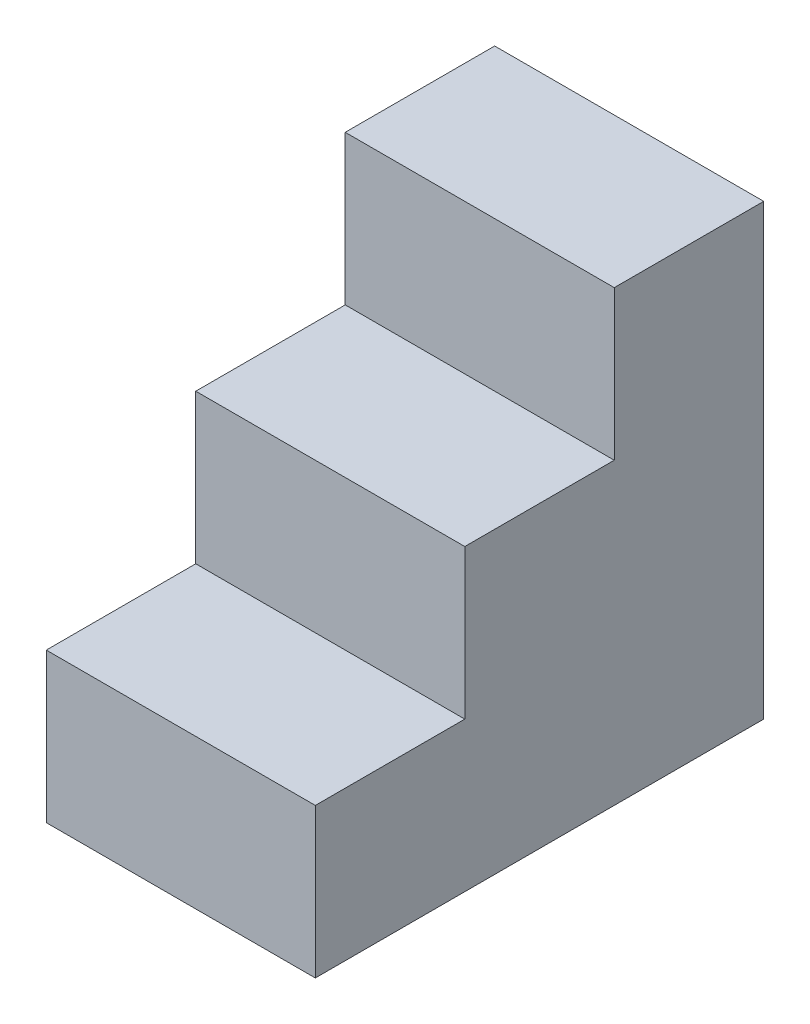
ISO-10303-21;
HEADER;
FILE_DESCRIPTION(('STEP AP214'),'2;1');
FILE_NAME('part.step','',(''),(''),'','','');
FILE_SCHEMA(('AUTOMOTIVE_DESIGN { 1 0 10303 214 1 1 1 1 }'));
ENDSEC;
DATA;
#1=APPLICATION_CONTEXT('core data for automotive mechanical design processes');
#2=APPLICATION_PROTOCOL_DEFINITION('international standard','automotive_design',2000,#1);
#3=PRODUCT_CONTEXT('',#1,'mechanical');
#4=PRODUCT('Part','Part','',(#3));
#5=PRODUCT_RELATED_PRODUCT_CATEGORY('part','',(#4));
#6=PRODUCT_DEFINITION_FORMATION('','',#4);
#7=PRODUCT_DEFINITION_CONTEXT('part definition',#1,'design');
#8=PRODUCT_DEFINITION('design','',#6,#7);
#9=PRODUCT_DEFINITION_SHAPE('','',#8);
#10=(LENGTH_UNIT() NAMED_UNIT(*) SI_UNIT(.MILLI.,.METRE.));
#11=(NAMED_UNIT(*) PLANE_ANGLE_UNIT() SI_UNIT($,.RADIAN.));
#12=(NAMED_UNIT(*) SI_UNIT($,.STERADIAN.) SOLID_ANGLE_UNIT());
#13=UNCERTAINTY_MEASURE_WITH_UNIT(LENGTH_MEASURE(1.E-05),#10,'distance_accuracy_value','');
#14=(GEOMETRIC_REPRESENTATION_CONTEXT(3) GLOBAL_UNCERTAINTY_ASSIGNED_CONTEXT((#13)) GLOBAL_UNIT_ASSIGNED_CONTEXT((#10,
#11,#12)) REPRESENTATION_CONTEXT('',''));
#15=CARTESIAN_POINT('',(0.,0.,0.));
#16=DIRECTION('',(0.,0.,1.));
#17=DIRECTION('',(1.,0.,0.));
#18=AXIS2_PLACEMENT_3D('',#15,#16,#17);
#19=CARTESIAN_POINT('',(19.8,-33.,0.));
#20=DIRECTION('',(0.,0.,1.));
#21=DIRECTION('',(1.,0.,0.));
#22=AXIS2_PLACEMENT_3D('',#19,#20,#21);
#23=PLANE('',#22);
#24=DIRECTION('',(0.,1.,0.));
#25=VECTOR('',#24,1.);
#26=CARTESIAN_POINT('',(0.,-33.,0.));
#27=LINE('',#26,#25);
#28=CARTESIAN_POINT('',(0.,-33.,0.));
#29=VERTEX_POINT('',#28);
#30=CARTESIAN_POINT('',(0.,0.,0.));
#31=VERTEX_POINT('',#30);
#32=EDGE_CURVE('E135',#29,#31,#27,.T.);
#33=ORIENTED_EDGE('',*,*,#32,.T.);
#34=DIRECTION('',(-1.,0.,0.));
#35=VECTOR('',#34,1.);
#36=CARTESIAN_POINT('',(19.8,0.,0.));
#37=LINE('',#36,#35);
#38=CARTESIAN_POINT('',(19.8,0.,0.));
#39=VERTEX_POINT('',#38);
#40=EDGE_CURVE('E11',#39,#31,#37,.T.);
#41=ORIENTED_EDGE('',*,*,#40,.F.);
#42=DIRECTION('',(0.,1.,0.));
#43=VECTOR('',#42,1.);
#44=CARTESIAN_POINT('',(19.8,-33.,0.));
#45=LINE('',#44,#43);
#46=CARTESIAN_POINT('',(19.8,-33.,0.));
#47=VERTEX_POINT('',#46);
#48=EDGE_CURVE('E149',#47,#39,#45,.T.);
#49=ORIENTED_EDGE('',*,*,#48,.F.);
#50=DIRECTION('',(-1.,0.,0.));
#51=VECTOR('',#50,1.);
#52=CARTESIAN_POINT('',(19.8,-33.,0.));
#53=LINE('',#52,#51);
#54=EDGE_CURVE('E131',#47,#29,#53,.T.);
#55=ORIENTED_EDGE('',*,*,#54,.T.);
#56=EDGE_LOOP('',(#33,#41,#49,#55));
#57=FACE_BOUND('',#56,.T.);
#58=ADVANCED_FACE('F39',(#57),#23,.F.);
#59=CARTESIAN_POINT('',(19.8,0.,0.));
#60=DIRECTION('',(0.,-1.,0.));
#61=DIRECTION('',(0.,0.,-1.));
#62=AXIS2_PLACEMENT_3D('',#59,#60,#61);
#63=PLANE('',#62);
#64=DIRECTION('',(0.,0.,1.));
#65=VECTOR('',#64,1.);
#66=CARTESIAN_POINT('',(0.,0.,0.));
#67=LINE('',#66,#65);
#68=CARTESIAN_POINT('',(0.,0.,11.));
#69=VERTEX_POINT('',#68);
#70=EDGE_CURVE('E138',#31,#69,#67,.T.);
#71=ORIENTED_EDGE('',*,*,#70,.T.);
#72=DIRECTION('',(-1.,0.,0.));
#73=VECTOR('',#72,1.);
#74=CARTESIAN_POINT('',(19.8,0.,11.));
#75=LINE('',#74,#73);
#76=CARTESIAN_POINT('',(19.8,0.,11.));
#77=VERTEX_POINT('',#76);
#78=EDGE_CURVE('E47',#77,#69,#75,.T.);
#79=ORIENTED_EDGE('',*,*,#78,.F.);
#80=DIRECTION('',(0.,0.,1.));
#81=VECTOR('',#80,1.);
#82=CARTESIAN_POINT('',(19.8,0.,0.));
#83=LINE('',#82,#81);
#84=EDGE_CURVE('E98',#39,#77,#83,.T.);
#85=ORIENTED_EDGE('',*,*,#84,.F.);
#86=ORIENTED_EDGE('',*,*,#40,.T.);
#87=EDGE_LOOP('',(#71,#79,#85,#86));
#88=FACE_BOUND('',#87,.T.);
#89=ADVANCED_FACE('F184',(#88),#63,.F.);
#90=CARTESIAN_POINT('',(19.8,0.,11.));
#91=DIRECTION('',(0.,0.,-1.));
#92=DIRECTION('',(-1.,0.,0.));
#93=AXIS2_PLACEMENT_3D('',#90,#91,#92);
#94=PLANE('',#93);
#95=DIRECTION('',(0.,-1.,0.));
#96=VECTOR('',#95,1.);
#97=CARTESIAN_POINT('',(0.,0.,11.));
#98=LINE('',#97,#96);
#99=CARTESIAN_POINT('',(0.,-11.,11.));
#100=VERTEX_POINT('',#99);
#101=EDGE_CURVE('E140',#69,#100,#98,.T.);
#102=ORIENTED_EDGE('',*,*,#101,.T.);
#103=DIRECTION('',(-1.,0.,0.));
#104=VECTOR('',#103,1.);
#105=CARTESIAN_POINT('',(19.8,-11.,11.));
#106=LINE('',#105,#104);
#107=CARTESIAN_POINT('',(19.8,-11.,11.));
#108=VERTEX_POINT('',#107);
#109=EDGE_CURVE('E156',#108,#100,#106,.T.);
#110=ORIENTED_EDGE('',*,*,#109,.F.);
#111=DIRECTION('',(0.,-1.,0.));
#112=VECTOR('',#111,1.);
#113=CARTESIAN_POINT('',(19.8,0.,11.));
#114=LINE('',#113,#112);
#115=EDGE_CURVE('E164',#77,#108,#114,.T.);
#116=ORIENTED_EDGE('',*,*,#115,.F.);
#117=ORIENTED_EDGE('',*,*,#78,.T.);
#118=EDGE_LOOP('',(#102,#110,#116,#117));
#119=FACE_BOUND('',#118,.T.);
#120=ADVANCED_FACE('F162',(#119),#94,.F.);
#121=CARTESIAN_POINT('',(19.8,-11.,11.));
#122=DIRECTION('',(0.,-1.,0.));
#123=DIRECTION('',(0.,0.,-1.));
#124=AXIS2_PLACEMENT_3D('',#121,#122,#123);
#125=PLANE('',#124);
#126=DIRECTION('',(0.,0.,1.));
#127=VECTOR('',#126,1.);
#128=CARTESIAN_POINT('',(0.,-11.,11.));
#129=LINE('',#128,#127);
#130=CARTESIAN_POINT('',(0.,-11.,22.));
#131=VERTEX_POINT('',#130);
#132=EDGE_CURVE('E142',#100,#131,#129,.T.);
#133=ORIENTED_EDGE('',*,*,#132,.T.);
#134=DIRECTION('',(-1.,0.,0.));
#135=VECTOR('',#134,1.);
#136=CARTESIAN_POINT('',(19.8,-11.,22.));
#137=LINE('',#136,#135);
#138=CARTESIAN_POINT('',(19.8,-11.,22.));
#139=VERTEX_POINT('',#138);
#140=EDGE_CURVE('E153',#139,#131,#137,.T.);
#141=ORIENTED_EDGE('',*,*,#140,.F.);
#142=DIRECTION('',(0.,0.,1.));
#143=VECTOR('',#142,1.);
#144=CARTESIAN_POINT('',(19.8,-11.,11.));
#145=LINE('',#144,#143);
#146=EDGE_CURVE('E176',#108,#139,#145,.T.);
#147=ORIENTED_EDGE('',*,*,#146,.F.);
#148=ORIENTED_EDGE('',*,*,#109,.T.);
#149=EDGE_LOOP('',(#133,#141,#147,#148));
#150=FACE_BOUND('',#149,.T.);
#151=ADVANCED_FACE('F172',(#150),#125,.F.);
#152=CARTESIAN_POINT('',(19.8,-11.,22.));
#153=DIRECTION('',(0.,0.,-1.));
#154=DIRECTION('',(-1.,0.,0.));
#155=AXIS2_PLACEMENT_3D('',#152,#153,#154);
#156=PLANE('',#155);
#157=DIRECTION('',(0.,-1.,0.));
#158=VECTOR('',#157,1.);
#159=CARTESIAN_POINT('',(0.,-11.,22.));
#160=LINE('',#159,#158);
#161=CARTESIAN_POINT('',(0.,-22.,22.));
#162=VERTEX_POINT('',#161);
#163=EDGE_CURVE('E144',#131,#162,#160,.T.);
#164=ORIENTED_EDGE('',*,*,#163,.T.);
#165=DIRECTION('',(-1.,0.,0.));
#166=VECTOR('',#165,1.);
#167=CARTESIAN_POINT('',(19.8,-22.,22.));
#168=LINE('',#167,#166);
#169=CARTESIAN_POINT('',(19.8,-22.,22.));
#170=VERTEX_POINT('',#169);
#171=EDGE_CURVE('E126',#170,#162,#168,.T.);
#172=ORIENTED_EDGE('',*,*,#171,.F.);
#173=DIRECTION('',(0.,-1.,0.));
#174=VECTOR('',#173,1.);
#175=CARTESIAN_POINT('',(19.8,-11.,22.));
#176=LINE('',#175,#174);
#177=EDGE_CURVE('E117',#139,#170,#176,.T.);
#178=ORIENTED_EDGE('',*,*,#177,.F.);
#179=ORIENTED_EDGE('',*,*,#140,.T.);
#180=EDGE_LOOP('',(#164,#172,#178,#179));
#181=FACE_BOUND('',#180,.T.);
#182=ADVANCED_FACE('F175',(#181),#156,.F.);
#183=CARTESIAN_POINT('',(19.8,-22.,22.));
#184=DIRECTION('',(0.,-1.,0.));
#185=DIRECTION('',(0.,0.,-1.));
#186=AXIS2_PLACEMENT_3D('',#183,#184,#185);
#187=PLANE('',#186);
#188=DIRECTION('',(0.,0.,1.));
#189=VECTOR('',#188,1.);
#190=CARTESIAN_POINT('',(0.,-22.,22.));
#191=LINE('',#190,#189);
#192=CARTESIAN_POINT('',(0.,-22.,33.));
#193=VERTEX_POINT('',#192);
#194=EDGE_CURVE('E125',#162,#193,#191,.T.);
#195=ORIENTED_EDGE('',*,*,#194,.T.);
#196=DIRECTION('',(-1.,0.,0.));
#197=VECTOR('',#196,1.);
#198=CARTESIAN_POINT('',(19.8,-22.,33.));
#199=LINE('',#198,#197);
#200=CARTESIAN_POINT('',(19.8,-22.,33.));
#201=VERTEX_POINT('',#200);
#202=EDGE_CURVE('E122',#201,#193,#199,.T.);
#203=ORIENTED_EDGE('',*,*,#202,.F.);
#204=DIRECTION('',(0.,0.,1.));
#205=VECTOR('',#204,1.);
#206=CARTESIAN_POINT('',(19.8,-22.,22.));
#207=LINE('',#206,#205);
#208=EDGE_CURVE('E111',#170,#201,#207,.T.);
#209=ORIENTED_EDGE('',*,*,#208,.F.);
#210=ORIENTED_EDGE('',*,*,#171,.T.);
#211=EDGE_LOOP('',(#195,#203,#209,#210));
#212=FACE_BOUND('',#211,.T.);
#213=ADVANCED_FACE('F123',(#212),#187,.F.);
#214=CARTESIAN_POINT('',(19.8,-22.,33.));
#215=DIRECTION('',(0.,0.,-1.));
#216=DIRECTION('',(0.,1.,0.));
#217=AXIS2_PLACEMENT_3D('',#214,#215,#216);
#218=PLANE('',#217);
#219=DIRECTION('',(0.,-1.,0.));
#220=VECTOR('',#219,1.);
#221=CARTESIAN_POINT('',(0.,-22.,33.));
#222=LINE('',#221,#220);
#223=CARTESIAN_POINT('',(0.,-33.,33.));
#224=VERTEX_POINT('',#223);
#225=EDGE_CURVE('E84',#193,#224,#222,.T.);
#226=ORIENTED_EDGE('',*,*,#225,.T.);
#227=DIRECTION('',(-1.,0.,0.));
#228=VECTOR('',#227,1.);
#229=CARTESIAN_POINT('',(19.8,-33.,33.));
#230=LINE('',#229,#228);
#231=CARTESIAN_POINT('',(19.8,-33.,33.));
#232=VERTEX_POINT('',#231);
#233=EDGE_CURVE('E127',#232,#224,#230,.T.);
#234=ORIENTED_EDGE('',*,*,#233,.F.);
#235=DIRECTION('',(0.,-1.,0.));
#236=VECTOR('',#235,1.);
#237=CARTESIAN_POINT('',(19.8,-22.,33.));
#238=LINE('',#237,#236);
#239=EDGE_CURVE('E115',#201,#232,#238,.T.);
#240=ORIENTED_EDGE('',*,*,#239,.F.);
#241=ORIENTED_EDGE('',*,*,#202,.T.);
#242=EDGE_LOOP('',(#226,#234,#240,#241));
#243=FACE_BOUND('',#242,.T.);
#244=ADVANCED_FACE('F129',(#243),#218,.F.);
#245=CARTESIAN_POINT('',(19.8,-33.,33.));
#246=DIRECTION('',(0.,1.,0.));
#247=DIRECTION('',(0.,0.,1.));
#248=AXIS2_PLACEMENT_3D('',#245,#246,#247);
#249=PLANE('',#248);
#250=DIRECTION('',(0.,0.,-1.));
#251=VECTOR('',#250,1.);
#252=CARTESIAN_POINT('',(0.,-33.,33.));
#253=LINE('',#252,#251);
#254=EDGE_CURVE('E90',#224,#29,#253,.T.);
#255=ORIENTED_EDGE('',*,*,#254,.T.);
#256=ORIENTED_EDGE('',*,*,#54,.F.);
#257=DIRECTION('',(0.,0.,-1.));
#258=VECTOR('',#257,1.);
#259=CARTESIAN_POINT('',(19.8,-33.,33.));
#260=LINE('',#259,#258);
#261=EDGE_CURVE('E55',#232,#47,#260,.T.);
#262=ORIENTED_EDGE('',*,*,#261,.F.);
#263=ORIENTED_EDGE('',*,*,#233,.T.);
#264=EDGE_LOOP('',(#255,#256,#262,#263));
#265=FACE_BOUND('',#264,.T.);
#266=ADVANCED_FACE('F200',(#265),#249,.F.);
#267=CARTESIAN_POINT('',(19.8,0.,0.));
#268=DIRECTION('',(1.,0.,0.));
#269=DIRECTION('',(0.,0.,-1.));
#270=AXIS2_PLACEMENT_3D('',#267,#268,#269);
#271=PLANE('',#270);
#272=ORIENTED_EDGE('',*,*,#48,.T.);
#273=ORIENTED_EDGE('',*,*,#84,.T.);
#274=ORIENTED_EDGE('',*,*,#115,.T.);
#275=ORIENTED_EDGE('',*,*,#146,.T.);
#276=ORIENTED_EDGE('',*,*,#177,.T.);
#277=ORIENTED_EDGE('',*,*,#208,.T.);
#278=ORIENTED_EDGE('',*,*,#239,.T.);
#279=ORIENTED_EDGE('',*,*,#261,.T.);
#280=EDGE_LOOP('',(#272,#273,#274,#275,#276,#277,#278,#279));
#281=FACE_BOUND('',#280,.T.);
#282=ADVANCED_FACE('F113',(#281),#271,.T.);
#283=CARTESIAN_POINT('',(0.,0.,0.));
#284=DIRECTION('',(1.,0.,0.));
#285=DIRECTION('',(0.,0.,-1.));
#286=AXIS2_PLACEMENT_3D('',#283,#284,#285);
#287=PLANE('',#286);
#288=ORIENTED_EDGE('',*,*,#32,.F.);
#289=ORIENTED_EDGE('',*,*,#254,.F.);
#290=ORIENTED_EDGE('',*,*,#225,.F.);
#291=ORIENTED_EDGE('',*,*,#194,.F.);
#292=ORIENTED_EDGE('',*,*,#163,.F.);
#293=ORIENTED_EDGE('',*,*,#132,.F.);
#294=ORIENTED_EDGE('',*,*,#101,.F.);
#295=ORIENTED_EDGE('',*,*,#70,.F.);
#296=EDGE_LOOP('',(#288,#289,#290,#291,#292,#293,#294,#295));
#297=FACE_BOUND('',#296,.T.);
#298=ADVANCED_FACE('F168',(#297),#287,.F.);
#299=CLOSED_SHELL('',(#58,#89,#120,#151,#182,#213,#244,#266,#282,#298));
#300=MANIFOLD_SOLID_BREP('B2',#299);
#301=ADVANCED_BREP_SHAPE_REPRESENTATION('',(#18,#300),#14);
#302=SHAPE_DEFINITION_REPRESENTATION(#9,#301);
ENDSEC;
END-ISO-10303-21;
